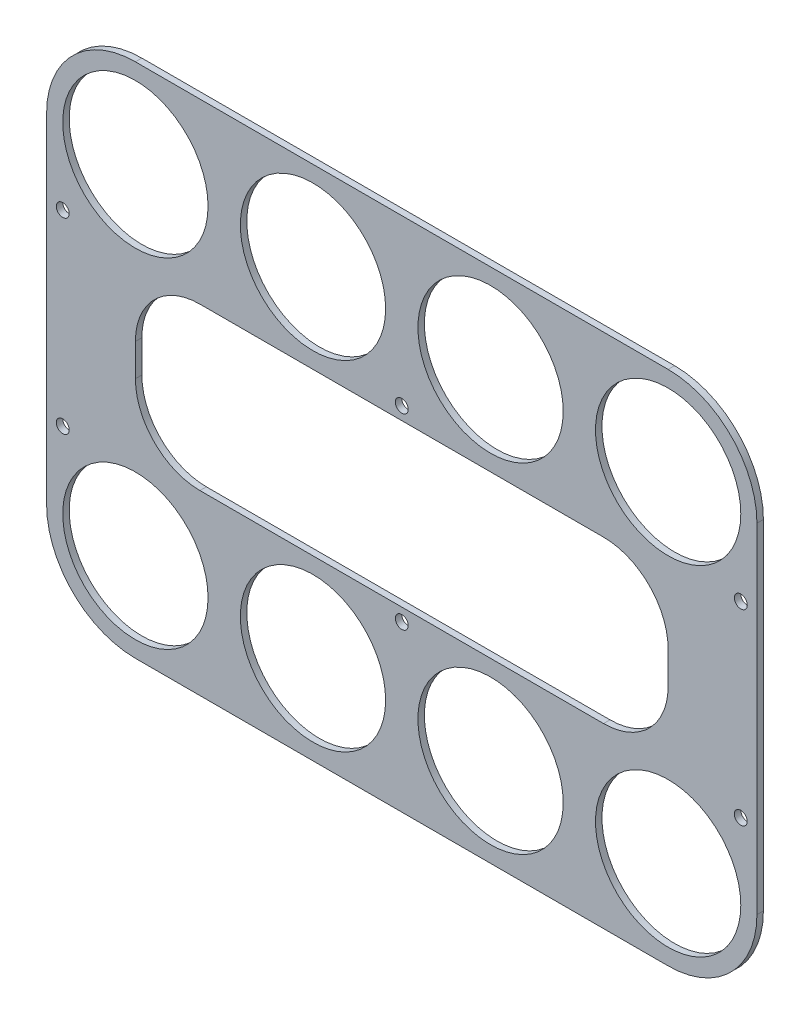
ISO-10303-21;
HEADER;
FILE_DESCRIPTION(('STEP AP214'),'2;1');
FILE_NAME('part.step','',(''),(''),'','','');
FILE_SCHEMA(('AUTOMOTIVE_DESIGN { 1 0 10303 214 1 1 1 1 }'));
ENDSEC;
DATA;
#1=APPLICATION_CONTEXT('core data for automotive mechanical design processes');
#2=APPLICATION_PROTOCOL_DEFINITION('international standard','automotive_design',2000,#1);
#3=PRODUCT_CONTEXT('',#1,'mechanical');
#4=PRODUCT('Part','Part','',(#3));
#5=PRODUCT_RELATED_PRODUCT_CATEGORY('part','',(#4));
#6=PRODUCT_DEFINITION_FORMATION('','',#4);
#7=PRODUCT_DEFINITION_CONTEXT('part definition',#1,'design');
#8=PRODUCT_DEFINITION('design','',#6,#7);
#9=PRODUCT_DEFINITION_SHAPE('','',#8);
#10=(LENGTH_UNIT() NAMED_UNIT(*) SI_UNIT(.MILLI.,.METRE.));
#11=(NAMED_UNIT(*) PLANE_ANGLE_UNIT() SI_UNIT($,.RADIAN.));
#12=(NAMED_UNIT(*) SI_UNIT($,.STERADIAN.) SOLID_ANGLE_UNIT());
#13=UNCERTAINTY_MEASURE_WITH_UNIT(LENGTH_MEASURE(1.E-05),#10,'distance_accuracy_value','');
#14=(GEOMETRIC_REPRESENTATION_CONTEXT(3) GLOBAL_UNCERTAINTY_ASSIGNED_CONTEXT((#13)) GLOBAL_UNIT_ASSIGNED_CONTEXT((#10,
#11,#12)) REPRESENTATION_CONTEXT('',''));
#15=CARTESIAN_POINT('',(0.,0.,0.));
#16=DIRECTION('',(0.,0.,1.));
#17=DIRECTION('',(1.,0.,0.));
#18=AXIS2_PLACEMENT_3D('',#15,#16,#17);
#19=CARTESIAN_POINT('',(74.5679017625473,-66.9135800687628,0.));
#20=DIRECTION('',(0.,0.,1.));
#21=DIRECTION('',(1.,0.,0.));
#22=AXIS2_PLACEMENT_3D('',#19,#20,#21);
#23=PLANE('',#22);
#24=CARTESIAN_POINT('',(12.0679017625473,-71.9135800687628,0.));
#25=DIRECTION('',(0.,0.,-1.));
#26=DIRECTION('',(-1.,0.,0.));
#27=AXIS2_PLACEMENT_3D('',#24,#25,#26);
#28=CIRCLE('',#27,20.);
#29=CARTESIAN_POINT('',(-7.93209823745267,-71.9135800687628,0.));
#30=VERTEX_POINT('',#29);
#31=CARTESIAN_POINT('',(12.0679017625473,-91.9135800687628,0.));
#32=VERTEX_POINT('',#31);
#33=EDGE_CURVE('E267',#30,#32,#28,.F.);
#34=ORIENTED_EDGE('',*,*,#33,.T.);
#35=DIRECTION('',(1.,0.,0.));
#36=VECTOR('',#35,1.);
#37=CARTESIAN_POINT('',(-7.93209823745267,-91.9135800687628,0.));
#38=LINE('',#37,#36);
#39=CARTESIAN_POINT('',(137.067901762547,-91.9135800687628,0.));
#40=VERTEX_POINT('',#39);
#41=EDGE_CURVE('E361',#32,#40,#38,.T.);
#42=ORIENTED_EDGE('',*,*,#41,.T.);
#43=CARTESIAN_POINT('',(137.067901762547,-71.9135800687628,0.));
#44=DIRECTION('',(0.,0.,-1.));
#45=DIRECTION('',(-1.,0.,0.));
#46=AXIS2_PLACEMENT_3D('',#43,#44,#45);
#47=CIRCLE('',#46,20.);
#48=CARTESIAN_POINT('',(157.067901762547,-71.9135800687628,0.));
#49=VERTEX_POINT('',#48);
#50=EDGE_CURVE('E270',#40,#49,#47,.F.);
#51=ORIENTED_EDGE('',*,*,#50,.T.);
#52=DIRECTION('',(0.,1.,0.));
#53=VECTOR('',#52,1.);
#54=CARTESIAN_POINT('',(157.067901762547,-91.9135800687628,0.));
#55=LINE('',#54,#53);
#56=CARTESIAN_POINT('',(157.067901762547,-61.9135800687628,0.));
#57=VERTEX_POINT('',#56);
#58=EDGE_CURVE('E364',#49,#57,#55,.T.);
#59=ORIENTED_EDGE('',*,*,#58,.T.);
#60=CARTESIAN_POINT('',(137.067901762547,-61.9135800687628,0.));
#61=DIRECTION('',(0.,0.,-1.));
#62=DIRECTION('',(-1.,0.,0.));
#63=AXIS2_PLACEMENT_3D('',#60,#61,#62);
#64=CIRCLE('',#63,20.);
#65=CARTESIAN_POINT('',(137.067901762547,-41.9135800687628,0.));
#66=VERTEX_POINT('',#65);
#67=EDGE_CURVE('E274',#57,#66,#64,.F.);
#68=ORIENTED_EDGE('',*,*,#67,.T.);
#69=DIRECTION('',(1.,0.,0.));
#70=VECTOR('',#69,1.);
#71=CARTESIAN_POINT('',(157.067901762547,-41.9135800687628,0.));
#72=LINE('',#71,#70);
#73=CARTESIAN_POINT('',(12.0679017625473,-41.9135800687628,0.));
#74=VERTEX_POINT('',#73);
#75=EDGE_CURVE('E159',#66,#74,#72,.F.);
#76=ORIENTED_EDGE('',*,*,#75,.T.);
#77=CARTESIAN_POINT('',(12.0679017625473,-61.9135800687628,0.));
#78=DIRECTION('',(0.,0.,-1.));
#79=DIRECTION('',(-1.,0.,0.));
#80=AXIS2_PLACEMENT_3D('',#77,#78,#79);
#81=CIRCLE('',#80,20.);
#82=CARTESIAN_POINT('',(-7.93209823745267,-61.9135800687628,0.));
#83=VERTEX_POINT('',#82);
#84=EDGE_CURVE('E278',#74,#83,#81,.F.);
#85=ORIENTED_EDGE('',*,*,#84,.T.);
#86=DIRECTION('',(0.,1.,0.));
#87=VECTOR('',#86,1.);
#88=CARTESIAN_POINT('',(-7.93209823745267,-41.9135800687628,0.));
#89=LINE('',#88,#87);
#90=EDGE_CURVE('E281',#83,#30,#89,.F.);
#91=ORIENTED_EDGE('',*,*,#90,.T.);
#92=EDGE_LOOP('',(#34,#42,#51,#59,#68,#76,#85,#91));
#93=FACE_BOUND('',#92,.T.);
#94=CARTESIAN_POINT('',(-7.93209823745267,-14.4135800687628,0.));
#95=DIRECTION('',(0.,0.,1.));
#96=DIRECTION('',(1.,0.,0.));
#97=AXIS2_PLACEMENT_3D('',#94,#95,#96);
#98=CIRCLE('',#97,22.5);
#99=CARTESIAN_POINT('',(14.5679017625473,-14.4135800687628,0.));
#100=VERTEX_POINT('',#99);
#101=EDGE_CURVE('E282',#100,#100,#98,.T.);
#102=ORIENTED_EDGE('',*,*,#101,.T.);
#103=EDGE_LOOP('',(#102));
#104=FACE_BOUND('',#103,.T.);
#105=CARTESIAN_POINT('',(157.067901762547,-14.4135800687628,0.));
#106=DIRECTION('',(0.,0.,1.));
#107=DIRECTION('',(1.,0.,0.));
#108=AXIS2_PLACEMENT_3D('',#105,#106,#107);
#109=CIRCLE('',#108,22.5);
#110=CARTESIAN_POINT('',(179.567901762547,-14.4135800687628,0.));
#111=VERTEX_POINT('',#110);
#112=EDGE_CURVE('E285',#111,#111,#109,.T.);
#113=ORIENTED_EDGE('',*,*,#112,.T.);
#114=EDGE_LOOP('',(#113));
#115=FACE_BOUND('',#114,.T.);
#116=CARTESIAN_POINT('',(157.067901762547,-119.413580068763,0.));
#117=DIRECTION('',(0.,0.,1.));
#118=DIRECTION('',(1.,0.,0.));
#119=AXIS2_PLACEMENT_3D('',#116,#117,#118);
#120=CIRCLE('',#119,22.5);
#121=CARTESIAN_POINT('',(179.567901762547,-119.413580068763,0.));
#122=VERTEX_POINT('',#121);
#123=EDGE_CURVE('E290',#122,#122,#120,.T.);
#124=ORIENTED_EDGE('',*,*,#123,.T.);
#125=EDGE_LOOP('',(#124));
#126=FACE_BOUND('',#125,.T.);
#127=CARTESIAN_POINT('',(-7.93209823745267,-119.413580068763,0.));
#128=DIRECTION('',(0.,0.,1.));
#129=DIRECTION('',(1.,0.,0.));
#130=AXIS2_PLACEMENT_3D('',#127,#128,#129);
#131=CIRCLE('',#130,22.5);
#132=CARTESIAN_POINT('',(14.5679017625473,-119.413580068763,0.));
#133=VERTEX_POINT('',#132);
#134=EDGE_CURVE('E295',#133,#133,#131,.T.);
#135=ORIENTED_EDGE('',*,*,#134,.T.);
#136=EDGE_LOOP('',(#135));
#137=FACE_BOUND('',#136,.T.);
#138=CARTESIAN_POINT('',(47.0679017625473,-14.4135800687628,0.));
#139=DIRECTION('',(0.,0.,1.));
#140=DIRECTION('',(1.,0.,0.));
#141=AXIS2_PLACEMENT_3D('',#138,#139,#140);
#142=CIRCLE('',#141,22.5);
#143=CARTESIAN_POINT('',(69.5679017625473,-14.4135800687628,0.));
#144=VERTEX_POINT('',#143);
#145=EDGE_CURVE('E300',#144,#144,#142,.T.);
#146=ORIENTED_EDGE('',*,*,#145,.T.);
#147=EDGE_LOOP('',(#146));
#148=FACE_BOUND('',#147,.T.);
#149=CARTESIAN_POINT('',(102.067901762547,-14.4135800687628,0.));
#150=DIRECTION('',(0.,0.,1.));
#151=DIRECTION('',(1.,0.,0.));
#152=AXIS2_PLACEMENT_3D('',#149,#150,#151);
#153=CIRCLE('',#152,22.5);
#154=CARTESIAN_POINT('',(124.567901762547,-14.4135800687628,0.));
#155=VERTEX_POINT('',#154);
#156=EDGE_CURVE('E305',#155,#155,#153,.T.);
#157=ORIENTED_EDGE('',*,*,#156,.T.);
#158=EDGE_LOOP('',(#157));
#159=FACE_BOUND('',#158,.T.);
#160=CARTESIAN_POINT('',(102.067901762547,-119.413580068763,0.));
#161=DIRECTION('',(0.,0.,1.));
#162=DIRECTION('',(1.,0.,0.));
#163=AXIS2_PLACEMENT_3D('',#160,#161,#162);
#164=CIRCLE('',#163,22.5);
#165=CARTESIAN_POINT('',(124.567901762547,-119.413580068763,0.));
#166=VERTEX_POINT('',#165);
#167=EDGE_CURVE('E310',#166,#166,#164,.T.);
#168=ORIENTED_EDGE('',*,*,#167,.T.);
#169=EDGE_LOOP('',(#168));
#170=FACE_BOUND('',#169,.T.);
#171=CARTESIAN_POINT('',(47.0679017625473,-119.413580068763,0.));
#172=DIRECTION('',(0.,0.,1.));
#173=DIRECTION('',(1.,0.,0.));
#174=AXIS2_PLACEMENT_3D('',#171,#172,#173);
#175=CIRCLE('',#174,22.5);
#176=CARTESIAN_POINT('',(69.5679017625473,-119.413580068763,0.));
#177=VERTEX_POINT('',#176);
#178=EDGE_CURVE('E315',#177,#177,#175,.T.);
#179=ORIENTED_EDGE('',*,*,#178,.T.);
#180=EDGE_LOOP('',(#179));
#181=FACE_BOUND('',#180,.T.);
#182=CARTESIAN_POINT('',(-30.4320982374527,-37.9135800687628,0.));
#183=DIRECTION('',(0.,0.,1.));
#184=DIRECTION('',(1.,0.,0.));
#185=AXIS2_PLACEMENT_3D('',#182,#183,#184);
#186=CIRCLE('',#185,2.);
#187=CARTESIAN_POINT('',(-28.4320982374527,-37.9135800687628,0.));
#188=VERTEX_POINT('',#187);
#189=EDGE_CURVE('E320',#188,#188,#186,.T.);
#190=ORIENTED_EDGE('',*,*,#189,.T.);
#191=EDGE_LOOP('',(#190));
#192=FACE_BOUND('',#191,.T.);
#193=CARTESIAN_POINT('',(74.5679017625473,-37.9135800687628,0.));
#194=DIRECTION('',(0.,0.,1.));
#195=DIRECTION('',(1.,0.,0.));
#196=AXIS2_PLACEMENT_3D('',#193,#194,#195);
#197=CIRCLE('',#196,2.);
#198=CARTESIAN_POINT('',(76.5679017625473,-37.9135800687628,0.));
#199=VERTEX_POINT('',#198);
#200=EDGE_CURVE('E325',#199,#199,#197,.T.);
#201=ORIENTED_EDGE('',*,*,#200,.T.);
#202=EDGE_LOOP('',(#201));
#203=FACE_BOUND('',#202,.T.);
#204=CARTESIAN_POINT('',(179.567901762547,-37.9135800687628,0.));
#205=DIRECTION('',(0.,0.,1.));
#206=DIRECTION('',(1.,0.,0.));
#207=AXIS2_PLACEMENT_3D('',#204,#205,#206);
#208=CIRCLE('',#207,2.);
#209=CARTESIAN_POINT('',(181.567901762547,-37.9135800687628,0.));
#210=VERTEX_POINT('',#209);
#211=EDGE_CURVE('E330',#210,#210,#208,.T.);
#212=ORIENTED_EDGE('',*,*,#211,.T.);
#213=EDGE_LOOP('',(#212));
#214=FACE_BOUND('',#213,.T.);
#215=CARTESIAN_POINT('',(179.567901762547,-95.9135800687628,0.));
#216=DIRECTION('',(0.,0.,1.));
#217=DIRECTION('',(1.,0.,0.));
#218=AXIS2_PLACEMENT_3D('',#215,#216,#217);
#219=CIRCLE('',#218,2.);
#220=CARTESIAN_POINT('',(181.567901762547,-95.9135800687628,0.));
#221=VERTEX_POINT('',#220);
#222=EDGE_CURVE('E335',#221,#221,#219,.T.);
#223=ORIENTED_EDGE('',*,*,#222,.T.);
#224=EDGE_LOOP('',(#223));
#225=FACE_BOUND('',#224,.T.);
#226=CARTESIAN_POINT('',(74.5679017625473,-95.9135800687628,0.));
#227=DIRECTION('',(0.,0.,1.));
#228=DIRECTION('',(1.,0.,0.));
#229=AXIS2_PLACEMENT_3D('',#226,#227,#228);
#230=CIRCLE('',#229,2.);
#231=CARTESIAN_POINT('',(76.5679017625473,-95.9135800687628,0.));
#232=VERTEX_POINT('',#231);
#233=EDGE_CURVE('E154',#232,#232,#230,.T.);
#234=ORIENTED_EDGE('',*,*,#233,.T.);
#235=EDGE_LOOP('',(#234));
#236=FACE_BOUND('',#235,.T.);
#237=CARTESIAN_POINT('',(-30.4320982374527,-95.9135800687628,0.));
#238=DIRECTION('',(0.,0.,1.));
#239=DIRECTION('',(1.,0.,0.));
#240=AXIS2_PLACEMENT_3D('',#237,#238,#239);
#241=CIRCLE('',#240,2.);
#242=CARTESIAN_POINT('',(-28.4320982374527,-95.9135800687628,0.));
#243=VERTEX_POINT('',#242);
#244=EDGE_CURVE('E151',#243,#243,#241,.T.);
#245=ORIENTED_EDGE('',*,*,#244,.T.);
#246=EDGE_LOOP('',(#245));
#247=FACE_BOUND('',#246,.T.);
#248=DIRECTION('',(0.,1.,0.));
#249=VECTOR('',#248,1.);
#250=CARTESIAN_POINT('',(-35.4320982374527,-146.913580068763,0.));
#251=LINE('',#250,#249);
#252=CARTESIAN_POINT('',(-35.4320982374527,-14.4135800687628,0.));
#253=VERTEX_POINT('',#252);
#254=CARTESIAN_POINT('',(-35.4320982374527,-119.413580068763,0.));
#255=VERTEX_POINT('',#254);
#256=EDGE_CURVE('E132',#253,#255,#251,.F.);
#257=ORIENTED_EDGE('',*,*,#256,.F.);
#258=CARTESIAN_POINT('',(-7.93209823745268,-14.4135800687628,0.));
#259=DIRECTION('',(0.,0.,1.));
#260=DIRECTION('',(1.,0.,0.));
#261=AXIS2_PLACEMENT_3D('',#258,#259,#260);
#262=CIRCLE('',#261,27.5);
#263=CARTESIAN_POINT('',(-7.93209823745268,13.0864199312372,0.));
#264=VERTEX_POINT('',#263);
#265=EDGE_CURVE('E148',#264,#253,#262,.T.);
#266=ORIENTED_EDGE('',*,*,#265,.F.);
#267=DIRECTION('',(1.,0.,0.));
#268=VECTOR('',#267,1.);
#269=CARTESIAN_POINT('',(-35.4320982374527,13.0864199312372,0.));
#270=LINE('',#269,#268);
#271=CARTESIAN_POINT('',(157.067901762547,13.0864199312372,0.));
#272=VERTEX_POINT('',#271);
#273=EDGE_CURVE('E161',#272,#264,#270,.F.);
#274=ORIENTED_EDGE('',*,*,#273,.F.);
#275=CARTESIAN_POINT('',(157.067901762547,-14.4135800687628,0.));
#276=DIRECTION('',(0.,0.,1.));
#277=DIRECTION('',(1.,0.,0.));
#278=AXIS2_PLACEMENT_3D('',#275,#276,#277);
#279=CIRCLE('',#278,27.5);
#280=CARTESIAN_POINT('',(184.567901762547,-14.4135800687628,0.));
#281=VERTEX_POINT('',#280);
#282=EDGE_CURVE('E349',#281,#272,#279,.T.);
#283=ORIENTED_EDGE('',*,*,#282,.F.);
#284=DIRECTION('',(0.,1.,0.));
#285=VECTOR('',#284,1.);
#286=CARTESIAN_POINT('',(184.567901762547,13.0864199312372,0.));
#287=LINE('',#286,#285);
#288=CARTESIAN_POINT('',(184.567901762547,-119.413580068763,0.));
#289=VERTEX_POINT('',#288);
#290=EDGE_CURVE('E165',#289,#281,#287,.T.);
#291=ORIENTED_EDGE('',*,*,#290,.F.);
#292=CARTESIAN_POINT('',(157.067901762547,-119.413580068763,0.));
#293=DIRECTION('',(0.,0.,1.));
#294=DIRECTION('',(1.,0.,0.));
#295=AXIS2_PLACEMENT_3D('',#292,#293,#294);
#296=CIRCLE('',#295,27.5);
#297=CARTESIAN_POINT('',(157.067901762547,-146.913580068763,0.));
#298=VERTEX_POINT('',#297);
#299=EDGE_CURVE('E350',#298,#289,#296,.T.);
#300=ORIENTED_EDGE('',*,*,#299,.F.);
#301=DIRECTION('',(1.,0.,0.));
#302=VECTOR('',#301,1.);
#303=CARTESIAN_POINT('',(184.567901762547,-146.913580068763,0.));
#304=LINE('',#303,#302);
#305=CARTESIAN_POINT('',(-7.93209823745265,-146.913580068763,0.));
#306=VERTEX_POINT('',#305);
#307=EDGE_CURVE('E135',#306,#298,#304,.T.);
#308=ORIENTED_EDGE('',*,*,#307,.F.);
#309=CARTESIAN_POINT('',(-7.93209823745265,-119.413580068763,0.));
#310=DIRECTION('',(0.,0.,1.));
#311=DIRECTION('',(1.,0.,0.));
#312=AXIS2_PLACEMENT_3D('',#309,#310,#311);
#313=CIRCLE('',#312,27.5);
#314=EDGE_CURVE('E20',#255,#306,#313,.T.);
#315=ORIENTED_EDGE('',*,*,#314,.F.);
#316=EDGE_LOOP('',(#257,#266,#274,#283,#291,#300,#308,#315));
#317=FACE_BOUND('',#316,.T.);
#318=ADVANCED_FACE('F17',(#93,#104,#115,#126,#137,#148,#159,#170,#181,#192,#203,#214,#225,#236,
#247,#317),#23,.F.);
#319=CARTESIAN_POINT('',(-7.93209823745265,-119.413580068763,0.));
#320=DIRECTION('',(0.,0.,1.));
#321=DIRECTION('',(1.,0.,0.));
#322=AXIS2_PLACEMENT_3D('',#319,#320,#321);
#323=CYLINDRICAL_SURFACE('',#322,27.5);
#324=ORIENTED_EDGE('',*,*,#314,.T.);
#325=DIRECTION('',(0.,0.,-1.));
#326=VECTOR('',#325,1.);
#327=CARTESIAN_POINT('',(-7.93209823745264,-146.913580068763,0.));
#328=LINE('',#327,#326);
#329=CARTESIAN_POINT('',(-7.93209823745265,-146.913580068763,2.));
#330=VERTEX_POINT('',#329);
#331=EDGE_CURVE('E138',#330,#306,#328,.T.);
#332=ORIENTED_EDGE('',*,*,#331,.F.);
#333=CARTESIAN_POINT('',(-7.93209823745265,-119.413580068763,2.));
#334=DIRECTION('',(0.,0.,1.));
#335=DIRECTION('',(1.,0.,0.));
#336=AXIS2_PLACEMENT_3D('',#333,#334,#335);
#337=CIRCLE('',#336,27.5);
#338=CARTESIAN_POINT('',(-35.4320982374527,-119.413580068763,2.));
#339=VERTEX_POINT('',#338);
#340=EDGE_CURVE('E143',#339,#330,#337,.T.);
#341=ORIENTED_EDGE('',*,*,#340,.F.);
#342=DIRECTION('',(0.,0.,1.));
#343=VECTOR('',#342,1.);
#344=CARTESIAN_POINT('',(-35.4320982374527,-119.413580068763,0.));
#345=LINE('',#344,#343);
#346=EDGE_CURVE('E140',#255,#339,#345,.T.);
#347=ORIENTED_EDGE('',*,*,#346,.F.);
#348=EDGE_LOOP('',(#324,#332,#341,#347));
#349=FACE_BOUND('',#348,.T.);
#350=ADVANCED_FACE('F141',(#349),#323,.T.);
#351=CARTESIAN_POINT('',(184.567901762547,-146.913580068763,0.));
#352=DIRECTION('',(0.,-1.,0.));
#353=DIRECTION('',(0.,0.,-1.));
#354=AXIS2_PLACEMENT_3D('',#351,#352,#353);
#355=PLANE('',#354);
#356=DIRECTION('',(0.,0.,1.));
#357=VECTOR('',#356,1.);
#358=CARTESIAN_POINT('',(157.067901762547,-146.913580068763,0.));
#359=LINE('',#358,#357);
#360=CARTESIAN_POINT('',(157.067901762547,-146.913580068763,2.));
#361=VERTEX_POINT('',#360);
#362=EDGE_CURVE('E169',#361,#298,#359,.F.);
#363=ORIENTED_EDGE('',*,*,#362,.F.);
#364=DIRECTION('',(1.,0.,0.));
#365=VECTOR('',#364,1.);
#366=CARTESIAN_POINT('',(74.5679017625473,-146.913580068763,2.));
#367=LINE('',#366,#365);
#368=EDGE_CURVE('E265',#330,#361,#367,.T.);
#369=ORIENTED_EDGE('',*,*,#368,.F.);
#370=ORIENTED_EDGE('',*,*,#331,.T.);
#371=ORIENTED_EDGE('',*,*,#307,.T.);
#372=EDGE_LOOP('',(#363,#369,#370,#371));
#373=FACE_BOUND('',#372,.T.);
#374=ADVANCED_FACE('F535',(#373),#355,.T.);
#375=CARTESIAN_POINT('',(157.067901762547,-119.413580068763,0.));
#376=DIRECTION('',(0.,0.,1.));
#377=DIRECTION('',(1.,0.,0.));
#378=AXIS2_PLACEMENT_3D('',#375,#376,#377);
#379=CYLINDRICAL_SURFACE('',#378,27.5);
#380=ORIENTED_EDGE('',*,*,#299,.T.);
#381=DIRECTION('',(0.,0.,-1.));
#382=VECTOR('',#381,1.);
#383=CARTESIAN_POINT('',(184.567901762547,-119.413580068763,0.));
#384=LINE('',#383,#382);
#385=CARTESIAN_POINT('',(184.567901762547,-119.413580068763,2.));
#386=VERTEX_POINT('',#385);
#387=EDGE_CURVE('E168',#386,#289,#384,.T.);
#388=ORIENTED_EDGE('',*,*,#387,.F.);
#389=CARTESIAN_POINT('',(157.067901762547,-119.413580068763,2.));
#390=DIRECTION('',(0.,0.,1.));
#391=DIRECTION('',(1.,0.,0.));
#392=AXIS2_PLACEMENT_3D('',#389,#390,#391);
#393=CIRCLE('',#392,27.5);
#394=EDGE_CURVE('E262',#361,#386,#393,.T.);
#395=ORIENTED_EDGE('',*,*,#394,.F.);
#396=ORIENTED_EDGE('',*,*,#362,.T.);
#397=EDGE_LOOP('',(#380,#388,#395,#396));
#398=FACE_BOUND('',#397,.T.);
#399=ADVANCED_FACE('F585',(#398),#379,.T.);
#400=CARTESIAN_POINT('',(184.567901762547,13.0864199312372,0.));
#401=DIRECTION('',(1.,0.,0.));
#402=DIRECTION('',(0.,0.,-1.));
#403=AXIS2_PLACEMENT_3D('',#400,#401,#402);
#404=PLANE('',#403);
#405=DIRECTION('',(0.,0.,1.));
#406=VECTOR('',#405,1.);
#407=CARTESIAN_POINT('',(184.567901762547,-14.4135800687628,0.));
#408=LINE('',#407,#406);
#409=CARTESIAN_POINT('',(184.567901762547,-14.4135800687628,2.));
#410=VERTEX_POINT('',#409);
#411=EDGE_CURVE('E167',#410,#281,#408,.F.);
#412=ORIENTED_EDGE('',*,*,#411,.F.);
#413=DIRECTION('',(0.,1.,0.));
#414=VECTOR('',#413,1.);
#415=CARTESIAN_POINT('',(184.567901762547,-66.9135800687628,2.));
#416=LINE('',#415,#414);
#417=EDGE_CURVE('E261',#386,#410,#416,.T.);
#418=ORIENTED_EDGE('',*,*,#417,.F.);
#419=ORIENTED_EDGE('',*,*,#387,.T.);
#420=ORIENTED_EDGE('',*,*,#290,.T.);
#421=EDGE_LOOP('',(#412,#418,#419,#420));
#422=FACE_BOUND('',#421,.T.);
#423=ADVANCED_FACE('F391',(#422),#404,.T.);
#424=CARTESIAN_POINT('',(157.067901762547,-14.4135800687628,0.));
#425=DIRECTION('',(0.,0.,1.));
#426=DIRECTION('',(1.,0.,0.));
#427=AXIS2_PLACEMENT_3D('',#424,#425,#426);
#428=CYLINDRICAL_SURFACE('',#427,27.5);
#429=ORIENTED_EDGE('',*,*,#282,.T.);
#430=DIRECTION('',(0.,0.,1.));
#431=VECTOR('',#430,1.);
#432=CARTESIAN_POINT('',(157.067901762547,13.0864199312372,0.));
#433=LINE('',#432,#431);
#434=CARTESIAN_POINT('',(157.067901762547,13.0864199312372,2.));
#435=VERTEX_POINT('',#434);
#436=EDGE_CURVE('E164',#435,#272,#433,.F.);
#437=ORIENTED_EDGE('',*,*,#436,.F.);
#438=CARTESIAN_POINT('',(157.067901762547,-14.4135800687628,2.));
#439=DIRECTION('',(0.,0.,1.));
#440=DIRECTION('',(1.,0.,0.));
#441=AXIS2_PLACEMENT_3D('',#438,#439,#440);
#442=CIRCLE('',#441,27.5);
#443=EDGE_CURVE('E258',#410,#435,#442,.T.);
#444=ORIENTED_EDGE('',*,*,#443,.F.);
#445=ORIENTED_EDGE('',*,*,#411,.T.);
#446=EDGE_LOOP('',(#429,#437,#444,#445));
#447=FACE_BOUND('',#446,.T.);
#448=ADVANCED_FACE('F385',(#447),#428,.T.);
#449=CARTESIAN_POINT('',(-35.4320982374527,13.0864199312372,0.));
#450=DIRECTION('',(0.,1.,0.));
#451=DIRECTION('',(0.,0.,1.));
#452=AXIS2_PLACEMENT_3D('',#449,#450,#451);
#453=PLANE('',#452);
#454=DIRECTION('',(0.,0.,1.));
#455=VECTOR('',#454,1.);
#456=CARTESIAN_POINT('',(-7.93209823745268,13.0864199312372,0.));
#457=LINE('',#456,#455);
#458=CARTESIAN_POINT('',(-7.93209823745268,13.0864199312372,2.));
#459=VERTEX_POINT('',#458);
#460=EDGE_CURVE('E163',#459,#264,#457,.F.);
#461=ORIENTED_EDGE('',*,*,#460,.F.);
#462=DIRECTION('',(1.,0.,0.));
#463=VECTOR('',#462,1.);
#464=CARTESIAN_POINT('',(74.5679017625473,13.0864199312372,2.));
#465=LINE('',#464,#463);
#466=EDGE_CURVE('E257',#435,#459,#465,.F.);
#467=ORIENTED_EDGE('',*,*,#466,.F.);
#468=ORIENTED_EDGE('',*,*,#436,.T.);
#469=ORIENTED_EDGE('',*,*,#273,.T.);
#470=EDGE_LOOP('',(#461,#467,#468,#469));
#471=FACE_BOUND('',#470,.T.);
#472=ADVANCED_FACE('F394',(#471),#453,.T.);
#473=CARTESIAN_POINT('',(-7.93209823745268,-14.4135800687628,0.));
#474=DIRECTION('',(0.,0.,1.));
#475=DIRECTION('',(1.,0.,0.));
#476=AXIS2_PLACEMENT_3D('',#473,#474,#475);
#477=CYLINDRICAL_SURFACE('',#476,27.5);
#478=ORIENTED_EDGE('',*,*,#265,.T.);
#479=DIRECTION('',(0.,0.,1.));
#480=VECTOR('',#479,1.);
#481=CARTESIAN_POINT('',(-35.4320982374527,-14.4135800687628,0.));
#482=LINE('',#481,#480);
#483=CARTESIAN_POINT('',(-35.4320982374527,-14.4135800687628,2.));
#484=VERTEX_POINT('',#483);
#485=EDGE_CURVE('E147',#484,#253,#482,.F.);
#486=ORIENTED_EDGE('',*,*,#485,.F.);
#487=CARTESIAN_POINT('',(-7.93209823745268,-14.4135800687628,2.));
#488=DIRECTION('',(0.,0.,1.));
#489=DIRECTION('',(1.,0.,0.));
#490=AXIS2_PLACEMENT_3D('',#487,#488,#489);
#491=CIRCLE('',#490,27.5);
#492=EDGE_CURVE('E254',#459,#484,#491,.T.);
#493=ORIENTED_EDGE('',*,*,#492,.F.);
#494=ORIENTED_EDGE('',*,*,#460,.T.);
#495=EDGE_LOOP('',(#478,#486,#493,#494));
#496=FACE_BOUND('',#495,.T.);
#497=ADVANCED_FACE('F429',(#496),#477,.T.);
#498=CARTESIAN_POINT('',(-35.4320982374527,-146.913580068763,0.));
#499=DIRECTION('',(-1.,0.,0.));
#500=DIRECTION('',(0.,0.,1.));
#501=AXIS2_PLACEMENT_3D('',#498,#499,#500);
#502=PLANE('',#501);
#503=ORIENTED_EDGE('',*,*,#485,.T.);
#504=ORIENTED_EDGE('',*,*,#256,.T.);
#505=ORIENTED_EDGE('',*,*,#346,.T.);
#506=DIRECTION('',(0.,1.,0.));
#507=VECTOR('',#506,1.);
#508=CARTESIAN_POINT('',(-35.4320982374527,-66.9135800687628,2.));
#509=LINE('',#508,#507);
#510=EDGE_CURVE('E251',#484,#339,#509,.F.);
#511=ORIENTED_EDGE('',*,*,#510,.F.);
#512=EDGE_LOOP('',(#503,#504,#505,#511));
#513=FACE_BOUND('',#512,.T.);
#514=ADVANCED_FACE('F150',(#513),#502,.T.);
#515=CARTESIAN_POINT('',(-30.4320982374527,-95.9135800687628,-270.036762221579));
#516=DIRECTION('',(0.,0.,1.));
#517=DIRECTION('',(1.,0.,0.));
#518=AXIS2_PLACEMENT_3D('',#515,#516,#517);
#519=CYLINDRICAL_SURFACE('',#518,2.);
#520=CARTESIAN_POINT('',(-30.4320982374527,-95.9135800687628,2.));
#521=DIRECTION('',(0.,0.,1.));
#522=DIRECTION('',(1.,0.,0.));
#523=AXIS2_PLACEMENT_3D('',#520,#521,#522);
#524=CIRCLE('',#523,2.);
#525=CARTESIAN_POINT('',(-28.4320982374527,-95.9135800687628,2.));
#526=VERTEX_POINT('',#525);
#527=EDGE_CURVE('E246',#526,#526,#524,.F.);
#528=ORIENTED_EDGE('',*,*,#527,.F.);
#529=EDGE_LOOP('',(#528));
#530=FACE_BOUND('',#529,.T.);
#531=ORIENTED_EDGE('',*,*,#244,.F.);
#532=EDGE_LOOP('',(#531));
#533=FACE_BOUND('',#532,.T.);
#534=ADVANCED_FACE('F437',(#530,#533),#519,.F.);
#535=CARTESIAN_POINT('',(74.5679017625473,-95.9135800687628,-270.036762221579));
#536=DIRECTION('',(0.,0.,1.));
#537=DIRECTION('',(1.,0.,0.));
#538=AXIS2_PLACEMENT_3D('',#535,#536,#537);
#539=CYLINDRICAL_SURFACE('',#538,2.);
#540=CARTESIAN_POINT('',(74.5679017625473,-95.9135800687628,2.));
#541=DIRECTION('',(0.,0.,1.));
#542=DIRECTION('',(1.,0.,0.));
#543=AXIS2_PLACEMENT_3D('',#540,#541,#542);
#544=CIRCLE('',#543,2.);
#545=CARTESIAN_POINT('',(76.5679017625473,-95.9135800687628,2.));
#546=VERTEX_POINT('',#545);
#547=EDGE_CURVE('E241',#546,#546,#544,.F.);
#548=ORIENTED_EDGE('',*,*,#547,.F.);
#549=EDGE_LOOP('',(#548));
#550=FACE_BOUND('',#549,.T.);
#551=ORIENTED_EDGE('',*,*,#233,.F.);
#552=EDGE_LOOP('',(#551));
#553=FACE_BOUND('',#552,.T.);
#554=ADVANCED_FACE('F518',(#550,#553),#539,.F.);
#555=CARTESIAN_POINT('',(179.567901762547,-95.9135800687628,-270.036762221579));
#556=DIRECTION('',(0.,0.,1.));
#557=DIRECTION('',(1.,0.,0.));
#558=AXIS2_PLACEMENT_3D('',#555,#556,#557);
#559=CYLINDRICAL_SURFACE('',#558,2.);
#560=CARTESIAN_POINT('',(179.567901762547,-95.9135800687628,2.));
#561=DIRECTION('',(0.,0.,1.));
#562=DIRECTION('',(1.,0.,0.));
#563=AXIS2_PLACEMENT_3D('',#560,#561,#562);
#564=CIRCLE('',#563,2.);
#565=CARTESIAN_POINT('',(181.567901762547,-95.9135800687628,2.));
#566=VERTEX_POINT('',#565);
#567=EDGE_CURVE('E236',#566,#566,#564,.F.);
#568=ORIENTED_EDGE('',*,*,#567,.F.);
#569=EDGE_LOOP('',(#568));
#570=FACE_BOUND('',#569,.T.);
#571=ORIENTED_EDGE('',*,*,#222,.F.);
#572=EDGE_LOOP('',(#571));
#573=FACE_BOUND('',#572,.T.);
#574=ADVANCED_FACE('F514',(#570,#573),#559,.F.);
#575=CARTESIAN_POINT('',(179.567901762547,-37.9135800687628,-270.036762221579));
#576=DIRECTION('',(0.,0.,1.));
#577=DIRECTION('',(1.,0.,0.));
#578=AXIS2_PLACEMENT_3D('',#575,#576,#577);
#579=CYLINDRICAL_SURFACE('',#578,2.);
#580=CARTESIAN_POINT('',(179.567901762547,-37.9135800687628,2.));
#581=DIRECTION('',(0.,0.,1.));
#582=DIRECTION('',(1.,0.,0.));
#583=AXIS2_PLACEMENT_3D('',#580,#581,#582);
#584=CIRCLE('',#583,2.);
#585=CARTESIAN_POINT('',(181.567901762547,-37.9135800687628,2.));
#586=VERTEX_POINT('',#585);
#587=EDGE_CURVE('E231',#586,#586,#584,.F.);
#588=ORIENTED_EDGE('',*,*,#587,.F.);
#589=EDGE_LOOP('',(#588));
#590=FACE_BOUND('',#589,.T.);
#591=ORIENTED_EDGE('',*,*,#211,.F.);
#592=EDGE_LOOP('',(#591));
#593=FACE_BOUND('',#592,.T.);
#594=ADVANCED_FACE('F510',(#590,#593),#579,.F.);
#595=CARTESIAN_POINT('',(74.5679017625473,-37.9135800687628,-270.036762221579));
#596=DIRECTION('',(0.,0.,1.));
#597=DIRECTION('',(1.,0.,0.));
#598=AXIS2_PLACEMENT_3D('',#595,#596,#597);
#599=CYLINDRICAL_SURFACE('',#598,2.);
#600=CARTESIAN_POINT('',(74.5679017625473,-37.9135800687628,2.));
#601=DIRECTION('',(0.,0.,1.));
#602=DIRECTION('',(1.,0.,0.));
#603=AXIS2_PLACEMENT_3D('',#600,#601,#602);
#604=CIRCLE('',#603,2.);
#605=CARTESIAN_POINT('',(76.5679017625473,-37.9135800687628,2.));
#606=VERTEX_POINT('',#605);
#607=EDGE_CURVE('E226',#606,#606,#604,.F.);
#608=ORIENTED_EDGE('',*,*,#607,.F.);
#609=EDGE_LOOP('',(#608));
#610=FACE_BOUND('',#609,.T.);
#611=ORIENTED_EDGE('',*,*,#200,.F.);
#612=EDGE_LOOP('',(#611));
#613=FACE_BOUND('',#612,.T.);
#614=ADVANCED_FACE('F506',(#610,#613),#599,.F.);
#615=CARTESIAN_POINT('',(-30.4320982374527,-37.9135800687628,-270.036762221579));
#616=DIRECTION('',(0.,0.,1.));
#617=DIRECTION('',(1.,0.,0.));
#618=AXIS2_PLACEMENT_3D('',#615,#616,#617);
#619=CYLINDRICAL_SURFACE('',#618,2.);
#620=CARTESIAN_POINT('',(-30.4320982374527,-37.9135800687628,2.));
#621=DIRECTION('',(0.,0.,1.));
#622=DIRECTION('',(1.,0.,0.));
#623=AXIS2_PLACEMENT_3D('',#620,#621,#622);
#624=CIRCLE('',#623,2.);
#625=CARTESIAN_POINT('',(-28.4320982374527,-37.9135800687628,2.));
#626=VERTEX_POINT('',#625);
#627=EDGE_CURVE('E221',#626,#626,#624,.F.);
#628=ORIENTED_EDGE('',*,*,#627,.F.);
#629=EDGE_LOOP('',(#628));
#630=FACE_BOUND('',#629,.T.);
#631=ORIENTED_EDGE('',*,*,#189,.F.);
#632=EDGE_LOOP('',(#631));
#633=FACE_BOUND('',#632,.T.);
#634=ADVANCED_FACE('F502',(#630,#633),#619,.F.);
#635=CARTESIAN_POINT('',(47.0679017625473,-119.413580068763,-270.036762221579));
#636=DIRECTION('',(0.,0.,1.));
#637=DIRECTION('',(1.,0.,0.));
#638=AXIS2_PLACEMENT_3D('',#635,#636,#637);
#639=CYLINDRICAL_SURFACE('',#638,22.5);
#640=CARTESIAN_POINT('',(47.0679017625473,-119.413580068763,2.));
#641=DIRECTION('',(0.,0.,1.));
#642=DIRECTION('',(1.,0.,0.));
#643=AXIS2_PLACEMENT_3D('',#640,#641,#642);
#644=CIRCLE('',#643,22.5);
#645=CARTESIAN_POINT('',(69.5679017625473,-119.413580068763,2.));
#646=VERTEX_POINT('',#645);
#647=EDGE_CURVE('E216',#646,#646,#644,.F.);
#648=ORIENTED_EDGE('',*,*,#647,.F.);
#649=EDGE_LOOP('',(#648));
#650=FACE_BOUND('',#649,.T.);
#651=ORIENTED_EDGE('',*,*,#178,.F.);
#652=EDGE_LOOP('',(#651));
#653=FACE_BOUND('',#652,.T.);
#654=ADVANCED_FACE('F498',(#650,#653),#639,.F.);
#655=CARTESIAN_POINT('',(102.067901762547,-119.413580068763,-270.036762221579));
#656=DIRECTION('',(0.,0.,1.));
#657=DIRECTION('',(1.,0.,0.));
#658=AXIS2_PLACEMENT_3D('',#655,#656,#657);
#659=CYLINDRICAL_SURFACE('',#658,22.5);
#660=CARTESIAN_POINT('',(102.067901762547,-119.413580068763,2.));
#661=DIRECTION('',(0.,0.,1.));
#662=DIRECTION('',(1.,0.,0.));
#663=AXIS2_PLACEMENT_3D('',#660,#661,#662);
#664=CIRCLE('',#663,22.5);
#665=CARTESIAN_POINT('',(124.567901762547,-119.413580068763,2.));
#666=VERTEX_POINT('',#665);
#667=EDGE_CURVE('E211',#666,#666,#664,.F.);
#668=ORIENTED_EDGE('',*,*,#667,.F.);
#669=EDGE_LOOP('',(#668));
#670=FACE_BOUND('',#669,.T.);
#671=ORIENTED_EDGE('',*,*,#167,.F.);
#672=EDGE_LOOP('',(#671));
#673=FACE_BOUND('',#672,.T.);
#674=ADVANCED_FACE('F494',(#670,#673),#659,.F.);
#675=CARTESIAN_POINT('',(102.067901762547,-14.4135800687628,-270.036762221579));
#676=DIRECTION('',(0.,0.,1.));
#677=DIRECTION('',(1.,0.,0.));
#678=AXIS2_PLACEMENT_3D('',#675,#676,#677);
#679=CYLINDRICAL_SURFACE('',#678,22.5);
#680=CARTESIAN_POINT('',(102.067901762547,-14.4135800687628,2.));
#681=DIRECTION('',(0.,0.,1.));
#682=DIRECTION('',(1.,0.,0.));
#683=AXIS2_PLACEMENT_3D('',#680,#681,#682);
#684=CIRCLE('',#683,22.5);
#685=CARTESIAN_POINT('',(124.567901762547,-14.4135800687628,2.));
#686=VERTEX_POINT('',#685);
#687=EDGE_CURVE('E206',#686,#686,#684,.F.);
#688=ORIENTED_EDGE('',*,*,#687,.F.);
#689=EDGE_LOOP('',(#688));
#690=FACE_BOUND('',#689,.T.);
#691=ORIENTED_EDGE('',*,*,#156,.F.);
#692=EDGE_LOOP('',(#691));
#693=FACE_BOUND('',#692,.T.);
#694=ADVANCED_FACE('F490',(#690,#693),#679,.F.);
#695=CARTESIAN_POINT('',(47.0679017625473,-14.4135800687628,-270.036762221579));
#696=DIRECTION('',(0.,0.,1.));
#697=DIRECTION('',(1.,0.,0.));
#698=AXIS2_PLACEMENT_3D('',#695,#696,#697);
#699=CYLINDRICAL_SURFACE('',#698,22.5);
#700=CARTESIAN_POINT('',(47.0679017625473,-14.4135800687628,2.));
#701=DIRECTION('',(0.,0.,1.));
#702=DIRECTION('',(1.,0.,0.));
#703=AXIS2_PLACEMENT_3D('',#700,#701,#702);
#704=CIRCLE('',#703,22.5);
#705=CARTESIAN_POINT('',(69.5679017625473,-14.4135800687628,2.));
#706=VERTEX_POINT('',#705);
#707=EDGE_CURVE('E201',#706,#706,#704,.F.);
#708=ORIENTED_EDGE('',*,*,#707,.F.);
#709=EDGE_LOOP('',(#708));
#710=FACE_BOUND('',#709,.T.);
#711=ORIENTED_EDGE('',*,*,#145,.F.);
#712=EDGE_LOOP('',(#711));
#713=FACE_BOUND('',#712,.T.);
#714=ADVANCED_FACE('F486',(#710,#713),#699,.F.);
#715=CARTESIAN_POINT('',(-7.93209823745267,-119.413580068763,-270.036762221579));
#716=DIRECTION('',(0.,0.,1.));
#717=DIRECTION('',(1.,0.,0.));
#718=AXIS2_PLACEMENT_3D('',#715,#716,#717);
#719=CYLINDRICAL_SURFACE('',#718,22.5);
#720=CARTESIAN_POINT('',(-7.93209823745267,-119.413580068763,2.));
#721=DIRECTION('',(0.,0.,1.));
#722=DIRECTION('',(1.,0.,0.));
#723=AXIS2_PLACEMENT_3D('',#720,#721,#722);
#724=CIRCLE('',#723,22.5);
#725=CARTESIAN_POINT('',(14.5679017625473,-119.413580068763,2.));
#726=VERTEX_POINT('',#725);
#727=EDGE_CURVE('E196',#726,#726,#724,.F.);
#728=ORIENTED_EDGE('',*,*,#727,.F.);
#729=EDGE_LOOP('',(#728));
#730=FACE_BOUND('',#729,.T.);
#731=ORIENTED_EDGE('',*,*,#134,.F.);
#732=EDGE_LOOP('',(#731));
#733=FACE_BOUND('',#732,.T.);
#734=ADVANCED_FACE('F482',(#730,#733),#719,.F.);
#735=CARTESIAN_POINT('',(157.067901762547,-119.413580068763,-270.036762221579));
#736=DIRECTION('',(0.,0.,1.));
#737=DIRECTION('',(1.,0.,0.));
#738=AXIS2_PLACEMENT_3D('',#735,#736,#737);
#739=CYLINDRICAL_SURFACE('',#738,22.5);
#740=CARTESIAN_POINT('',(157.067901762547,-119.413580068763,2.));
#741=DIRECTION('',(0.,0.,1.));
#742=DIRECTION('',(1.,0.,0.));
#743=AXIS2_PLACEMENT_3D('',#740,#741,#742);
#744=CIRCLE('',#743,22.5);
#745=CARTESIAN_POINT('',(179.567901762547,-119.413580068763,2.));
#746=VERTEX_POINT('',#745);
#747=EDGE_CURVE('E191',#746,#746,#744,.F.);
#748=ORIENTED_EDGE('',*,*,#747,.F.);
#749=EDGE_LOOP('',(#748));
#750=FACE_BOUND('',#749,.T.);
#751=ORIENTED_EDGE('',*,*,#123,.F.);
#752=EDGE_LOOP('',(#751));
#753=FACE_BOUND('',#752,.T.);
#754=ADVANCED_FACE('F478',(#750,#753),#739,.F.);
#755=CARTESIAN_POINT('',(157.067901762547,-14.4135800687628,-270.036762221579));
#756=DIRECTION('',(0.,0.,1.));
#757=DIRECTION('',(1.,0.,0.));
#758=AXIS2_PLACEMENT_3D('',#755,#756,#757);
#759=CYLINDRICAL_SURFACE('',#758,22.5);
#760=CARTESIAN_POINT('',(157.067901762547,-14.4135800687628,2.));
#761=DIRECTION('',(0.,0.,1.));
#762=DIRECTION('',(1.,0.,0.));
#763=AXIS2_PLACEMENT_3D('',#760,#761,#762);
#764=CIRCLE('',#763,22.5);
#765=CARTESIAN_POINT('',(179.567901762547,-14.4135800687628,2.));
#766=VERTEX_POINT('',#765);
#767=EDGE_CURVE('E186',#766,#766,#764,.F.);
#768=ORIENTED_EDGE('',*,*,#767,.F.);
#769=EDGE_LOOP('',(#768));
#770=FACE_BOUND('',#769,.T.);
#771=ORIENTED_EDGE('',*,*,#112,.F.);
#772=EDGE_LOOP('',(#771));
#773=FACE_BOUND('',#772,.T.);
#774=ADVANCED_FACE('F474',(#770,#773),#759,.F.);
#775=CARTESIAN_POINT('',(-7.93209823745267,-14.4135800687628,-270.036762221579));
#776=DIRECTION('',(0.,0.,1.));
#777=DIRECTION('',(1.,0.,0.));
#778=AXIS2_PLACEMENT_3D('',#775,#776,#777);
#779=CYLINDRICAL_SURFACE('',#778,22.5);
#780=CARTESIAN_POINT('',(-7.93209823745267,-14.4135800687628,2.));
#781=DIRECTION('',(0.,0.,1.));
#782=DIRECTION('',(1.,0.,0.));
#783=AXIS2_PLACEMENT_3D('',#780,#781,#782);
#784=CIRCLE('',#783,22.5);
#785=CARTESIAN_POINT('',(14.5679017625473,-14.4135800687628,2.));
#786=VERTEX_POINT('',#785);
#787=EDGE_CURVE('E183',#786,#786,#784,.F.);
#788=ORIENTED_EDGE('',*,*,#787,.F.);
#789=EDGE_LOOP('',(#788));
#790=FACE_BOUND('',#789,.T.);
#791=ORIENTED_EDGE('',*,*,#101,.F.);
#792=EDGE_LOOP('',(#791));
#793=FACE_BOUND('',#792,.T.);
#794=ADVANCED_FACE('F470',(#790,#793),#779,.F.);
#795=CARTESIAN_POINT('',(-7.93209823745267,-41.9135800687628,2.));
#796=DIRECTION('',(-1.,0.,0.));
#797=DIRECTION('',(0.,0.,1.));
#798=AXIS2_PLACEMENT_3D('',#795,#796,#797);
#799=PLANE('',#798);
#800=ORIENTED_EDGE('',*,*,#90,.F.);
#801=DIRECTION('',(0.,0.,-1.));
#802=VECTOR('',#801,1.);
#803=CARTESIAN_POINT('',(-7.93209823745268,-61.9135800687628,2.));
#804=LINE('',#803,#802);
#805=CARTESIAN_POINT('',(-7.93209823745267,-61.9135800687628,2.));
#806=VERTEX_POINT('',#805);
#807=EDGE_CURVE('E280',#83,#806,#804,.F.);
#808=ORIENTED_EDGE('',*,*,#807,.T.);
#809=DIRECTION('',(0.,1.,0.));
#810=VECTOR('',#809,1.);
#811=CARTESIAN_POINT('',(-7.93209823745267,-66.9135800687628,2.));
#812=LINE('',#811,#810);
#813=CARTESIAN_POINT('',(-7.93209823745267,-71.9135800687628,2.));
#814=VERTEX_POINT('',#813);
#815=EDGE_CURVE('E182',#814,#806,#812,.T.);
#816=ORIENTED_EDGE('',*,*,#815,.F.);
#817=DIRECTION('',(0.,0.,-1.));
#818=VECTOR('',#817,1.);
#819=CARTESIAN_POINT('',(-7.93209823745267,-71.9135800687628,2.));
#820=LINE('',#819,#818);
#821=EDGE_CURVE('E269',#814,#30,#820,.T.);
#822=ORIENTED_EDGE('',*,*,#821,.T.);
#823=EDGE_LOOP('',(#800,#808,#816,#822));
#824=FACE_BOUND('',#823,.T.);
#825=ADVANCED_FACE('F466',(#824),#799,.F.);
#826=CARTESIAN_POINT('',(12.0679017625473,-61.9135800687628,2.));
#827=DIRECTION('',(0.,0.,-1.));
#828=DIRECTION('',(-1.,0.,0.));
#829=AXIS2_PLACEMENT_3D('',#826,#827,#828);
#830=CYLINDRICAL_SURFACE('',#829,20.);
#831=ORIENTED_EDGE('',*,*,#807,.F.);
#832=ORIENTED_EDGE('',*,*,#84,.F.);
#833=DIRECTION('',(0.,0.,1.));
#834=VECTOR('',#833,1.);
#835=CARTESIAN_POINT('',(12.0679017625473,-41.9135800687628,2.));
#836=LINE('',#835,#834);
#837=CARTESIAN_POINT('',(12.0679017625473,-41.9135800687628,2.));
#838=VERTEX_POINT('',#837);
#839=EDGE_CURVE('E277',#74,#838,#836,.T.);
#840=ORIENTED_EDGE('',*,*,#839,.T.);
#841=CARTESIAN_POINT('',(12.0679017625473,-61.9135800687628,2.));
#842=DIRECTION('',(0.,0.,-1.));
#843=DIRECTION('',(-1.,0.,0.));
#844=AXIS2_PLACEMENT_3D('',#841,#842,#843);
#845=CIRCLE('',#844,20.);
#846=EDGE_CURVE('E179',#806,#838,#845,.T.);
#847=ORIENTED_EDGE('',*,*,#846,.F.);
#848=EDGE_LOOP('',(#831,#832,#840,#847));
#849=FACE_BOUND('',#848,.T.);
#850=ADVANCED_FACE('F463',(#849),#830,.F.);
#851=CARTESIAN_POINT('',(157.067901762547,-41.9135800687628,2.));
#852=DIRECTION('',(0.,1.,0.));
#853=DIRECTION('',(0.,0.,1.));
#854=AXIS2_PLACEMENT_3D('',#851,#852,#853);
#855=PLANE('',#854);
#856=DIRECTION('',(1.,0.,0.));
#857=VECTOR('',#856,1.);
#858=CARTESIAN_POINT('',(74.5679017625473,-41.9135800687628,2.));
#859=LINE('',#858,#857);
#860=CARTESIAN_POINT('',(137.067901762547,-41.9135800687628,2.));
#861=VERTEX_POINT('',#860);
#862=EDGE_CURVE('E178',#838,#861,#859,.T.);
#863=ORIENTED_EDGE('',*,*,#862,.F.);
#864=ORIENTED_EDGE('',*,*,#839,.F.);
#865=ORIENTED_EDGE('',*,*,#75,.F.);
#866=DIRECTION('',(0.,0.,-1.));
#867=VECTOR('',#866,1.);
#868=CARTESIAN_POINT('',(137.067901762547,-41.9135800687628,2.));
#869=LINE('',#868,#867);
#870=EDGE_CURVE('E276',#66,#861,#869,.F.);
#871=ORIENTED_EDGE('',*,*,#870,.T.);
#872=EDGE_LOOP('',(#863,#864,#865,#871));
#873=FACE_BOUND('',#872,.T.);
#874=ADVANCED_FACE('F459',(#873),#855,.F.);
#875=CARTESIAN_POINT('',(137.067901762547,-61.9135800687628,2.));
#876=DIRECTION('',(0.,0.,-1.));
#877=DIRECTION('',(-1.,0.,0.));
#878=AXIS2_PLACEMENT_3D('',#875,#876,#877);
#879=CYLINDRICAL_SURFACE('',#878,20.);
#880=ORIENTED_EDGE('',*,*,#870,.F.);
#881=ORIENTED_EDGE('',*,*,#67,.F.);
#882=DIRECTION('',(0.,0.,-1.));
#883=VECTOR('',#882,1.);
#884=CARTESIAN_POINT('',(157.067901762547,-61.9135800687628,2.));
#885=LINE('',#884,#883);
#886=CARTESIAN_POINT('',(157.067901762547,-61.9135800687628,2.));
#887=VERTEX_POINT('',#886);
#888=EDGE_CURVE('E273',#57,#887,#885,.F.);
#889=ORIENTED_EDGE('',*,*,#888,.T.);
#890=CARTESIAN_POINT('',(137.067901762547,-61.9135800687628,2.));
#891=DIRECTION('',(0.,0.,-1.));
#892=DIRECTION('',(-1.,0.,0.));
#893=AXIS2_PLACEMENT_3D('',#890,#891,#892);
#894=CIRCLE('',#893,20.);
#895=EDGE_CURVE('E175',#861,#887,#894,.T.);
#896=ORIENTED_EDGE('',*,*,#895,.F.);
#897=EDGE_LOOP('',(#880,#881,#889,#896));
#898=FACE_BOUND('',#897,.T.);
#899=ADVANCED_FACE('F456',(#898),#879,.F.);
#900=CARTESIAN_POINT('',(157.067901762547,-91.9135800687628,2.));
#901=DIRECTION('',(1.,0.,0.));
#902=DIRECTION('',(0.,0.,-1.));
#903=AXIS2_PLACEMENT_3D('',#900,#901,#902);
#904=PLANE('',#903);
#905=DIRECTION('',(0.,1.,0.));
#906=VECTOR('',#905,1.);
#907=CARTESIAN_POINT('',(157.067901762547,-66.9135800687628,2.));
#908=LINE('',#907,#906);
#909=CARTESIAN_POINT('',(157.067901762547,-71.9135800687628,2.));
#910=VERTEX_POINT('',#909);
#911=EDGE_CURVE('E174',#887,#910,#908,.F.);
#912=ORIENTED_EDGE('',*,*,#911,.F.);
#913=ORIENTED_EDGE('',*,*,#888,.F.);
#914=ORIENTED_EDGE('',*,*,#58,.F.);
#915=DIRECTION('',(0.,0.,-1.));
#916=VECTOR('',#915,1.);
#917=CARTESIAN_POINT('',(157.067901762547,-71.9135800687628,2.));
#918=LINE('',#917,#916);
#919=EDGE_CURVE('E272',#49,#910,#918,.F.);
#920=ORIENTED_EDGE('',*,*,#919,.T.);
#921=EDGE_LOOP('',(#912,#913,#914,#920));
#922=FACE_BOUND('',#921,.T.);
#923=ADVANCED_FACE('F412',(#922),#904,.F.);
#924=CARTESIAN_POINT('',(137.067901762547,-71.9135800687628,2.));
#925=DIRECTION('',(0.,0.,-1.));
#926=DIRECTION('',(-1.,0.,0.));
#927=AXIS2_PLACEMENT_3D('',#924,#925,#926);
#928=CYLINDRICAL_SURFACE('',#927,20.);
#929=ORIENTED_EDGE('',*,*,#919,.F.);
#930=ORIENTED_EDGE('',*,*,#50,.F.);
#931=DIRECTION('',(0.,0.,-1.));
#932=VECTOR('',#931,1.);
#933=CARTESIAN_POINT('',(137.067901762547,-91.9135800687628,2.));
#934=LINE('',#933,#932);
#935=CARTESIAN_POINT('',(137.067901762547,-91.9135800687628,2.));
#936=VERTEX_POINT('',#935);
#937=EDGE_CURVE('E363',#40,#936,#934,.F.);
#938=ORIENTED_EDGE('',*,*,#937,.T.);
#939=CARTESIAN_POINT('',(137.067901762547,-71.9135800687628,2.));
#940=DIRECTION('',(0.,0.,-1.));
#941=DIRECTION('',(-1.,0.,0.));
#942=AXIS2_PLACEMENT_3D('',#939,#940,#941);
#943=CIRCLE('',#942,20.);
#944=EDGE_CURVE('E171',#910,#936,#943,.T.);
#945=ORIENTED_EDGE('',*,*,#944,.F.);
#946=EDGE_LOOP('',(#929,#930,#938,#945));
#947=FACE_BOUND('',#946,.T.);
#948=ADVANCED_FACE('F417',(#947),#928,.F.);
#949=CARTESIAN_POINT('',(-7.93209823745267,-91.9135800687628,2.));
#950=DIRECTION('',(0.,-1.,0.));
#951=DIRECTION('',(0.,0.,-1.));
#952=AXIS2_PLACEMENT_3D('',#949,#950,#951);
#953=PLANE('',#952);
#954=ORIENTED_EDGE('',*,*,#41,.F.);
#955=DIRECTION('',(0.,0.,-1.));
#956=VECTOR('',#955,1.);
#957=CARTESIAN_POINT('',(12.0679017625473,-91.9135800687628,2.));
#958=LINE('',#957,#956);
#959=CARTESIAN_POINT('',(12.0679017625473,-91.9135800687628,2.));
#960=VERTEX_POINT('',#959);
#961=EDGE_CURVE('E35',#32,#960,#958,.F.);
#962=ORIENTED_EDGE('',*,*,#961,.T.);
#963=DIRECTION('',(1.,0.,0.));
#964=VECTOR('',#963,1.);
#965=CARTESIAN_POINT('',(74.5679017625473,-91.9135800687628,2.));
#966=LINE('',#965,#964);
#967=EDGE_CURVE('E26',#936,#960,#966,.F.);
#968=ORIENTED_EDGE('',*,*,#967,.F.);
#969=ORIENTED_EDGE('',*,*,#937,.F.);
#970=EDGE_LOOP('',(#954,#962,#968,#969));
#971=FACE_BOUND('',#970,.T.);
#972=ADVANCED_FACE('F446',(#971),#953,.F.);
#973=CARTESIAN_POINT('',(12.0679017625473,-71.9135800687628,2.));
#974=DIRECTION('',(0.,0.,-1.));
#975=DIRECTION('',(-1.,0.,0.));
#976=AXIS2_PLACEMENT_3D('',#973,#974,#975);
#977=CYLINDRICAL_SURFACE('',#976,20.);
#978=ORIENTED_EDGE('',*,*,#961,.F.);
#979=ORIENTED_EDGE('',*,*,#33,.F.);
#980=ORIENTED_EDGE('',*,*,#821,.F.);
#981=CARTESIAN_POINT('',(12.0679017625473,-71.9135800687628,2.));
#982=DIRECTION('',(0.,0.,-1.));
#983=DIRECTION('',(-1.,0.,0.));
#984=AXIS2_PLACEMENT_3D('',#981,#982,#983);
#985=CIRCLE('',#984,20.);
#986=EDGE_CURVE('E11',#960,#814,#985,.T.);
#987=ORIENTED_EDGE('',*,*,#986,.F.);
#988=EDGE_LOOP('',(#978,#979,#980,#987));
#989=FACE_BOUND('',#988,.T.);
#990=ADVANCED_FACE('F441',(#989),#977,.F.);
#991=CARTESIAN_POINT('',(74.5679017625473,-66.9135800687628,2.));
#992=DIRECTION('',(0.,0.,1.));
#993=DIRECTION('',(1.,0.,0.));
#994=AXIS2_PLACEMENT_3D('',#991,#992,#993);
#995=PLANE('',#994);
#996=ORIENTED_EDGE('',*,*,#967,.T.);
#997=ORIENTED_EDGE('',*,*,#986,.T.);
#998=ORIENTED_EDGE('',*,*,#815,.T.);
#999=ORIENTED_EDGE('',*,*,#846,.T.);
#1000=ORIENTED_EDGE('',*,*,#862,.T.);
#1001=ORIENTED_EDGE('',*,*,#895,.T.);
#1002=ORIENTED_EDGE('',*,*,#911,.T.);
#1003=ORIENTED_EDGE('',*,*,#944,.T.);
#1004=EDGE_LOOP('',(#996,#997,#998,#999,#1000,#1001,#1002,#1003));
#1005=FACE_BOUND('',#1004,.T.);
#1006=ORIENTED_EDGE('',*,*,#787,.T.);
#1007=EDGE_LOOP('',(#1006));
#1008=FACE_BOUND('',#1007,.T.);
#1009=ORIENTED_EDGE('',*,*,#767,.T.);
#1010=EDGE_LOOP('',(#1009));
#1011=FACE_BOUND('',#1010,.T.);
#1012=ORIENTED_EDGE('',*,*,#747,.T.);
#1013=EDGE_LOOP('',(#1012));
#1014=FACE_BOUND('',#1013,.T.);
#1015=ORIENTED_EDGE('',*,*,#727,.T.);
#1016=EDGE_LOOP('',(#1015));
#1017=FACE_BOUND('',#1016,.T.);
#1018=ORIENTED_EDGE('',*,*,#707,.T.);
#1019=EDGE_LOOP('',(#1018));
#1020=FACE_BOUND('',#1019,.T.);
#1021=ORIENTED_EDGE('',*,*,#687,.T.);
#1022=EDGE_LOOP('',(#1021));
#1023=FACE_BOUND('',#1022,.T.);
#1024=ORIENTED_EDGE('',*,*,#667,.T.);
#1025=EDGE_LOOP('',(#1024));
#1026=FACE_BOUND('',#1025,.T.);
#1027=ORIENTED_EDGE('',*,*,#647,.T.);
#1028=EDGE_LOOP('',(#1027));
#1029=FACE_BOUND('',#1028,.T.);
#1030=ORIENTED_EDGE('',*,*,#627,.T.);
#1031=EDGE_LOOP('',(#1030));
#1032=FACE_BOUND('',#1031,.T.);
#1033=ORIENTED_EDGE('',*,*,#607,.T.);
#1034=EDGE_LOOP('',(#1033));
#1035=FACE_BOUND('',#1034,.T.);
#1036=ORIENTED_EDGE('',*,*,#587,.T.);
#1037=EDGE_LOOP('',(#1036));
#1038=FACE_BOUND('',#1037,.T.);
#1039=ORIENTED_EDGE('',*,*,#567,.T.);
#1040=EDGE_LOOP('',(#1039));
#1041=FACE_BOUND('',#1040,.T.);
#1042=ORIENTED_EDGE('',*,*,#547,.T.);
#1043=EDGE_LOOP('',(#1042));
#1044=FACE_BOUND('',#1043,.T.);
#1045=ORIENTED_EDGE('',*,*,#527,.T.);
#1046=EDGE_LOOP('',(#1045));
#1047=FACE_BOUND('',#1046,.T.);
#1048=ORIENTED_EDGE('',*,*,#492,.T.);
#1049=ORIENTED_EDGE('',*,*,#510,.T.);
#1050=ORIENTED_EDGE('',*,*,#340,.T.);
#1051=ORIENTED_EDGE('',*,*,#368,.T.);
#1052=ORIENTED_EDGE('',*,*,#394,.T.);
#1053=ORIENTED_EDGE('',*,*,#417,.T.);
#1054=ORIENTED_EDGE('',*,*,#443,.T.);
#1055=ORIENTED_EDGE('',*,*,#466,.T.);
#1056=EDGE_LOOP('',(#1048,#1049,#1050,#1051,#1052,#1053,#1054,#1055));
#1057=FACE_BOUND('',#1056,.T.);
#1058=ADVANCED_FACE('F399',(#1005,#1008,#1011,#1014,#1017,#1020,#1023,#1026,#1029,#1032,#1035,
#1038,#1041,#1044,#1047,#1057),#995,.T.);
#1059=CLOSED_SHELL('',(#318,#350,#374,#399,#423,#448,#472,#497,#514,#534,#554,#574,#594,#614,
#634,#654,#674,#694,#714,#734,#754,#774,#794,#825,#850,#874,#899,#923,#948,#972,#990,#1058));
#1060=MANIFOLD_SOLID_BREP('B1',#1059);
#1061=ADVANCED_BREP_SHAPE_REPRESENTATION('',(#18,#1060),#14);
#1062=SHAPE_DEFINITION_REPRESENTATION(#9,#1061);
ENDSEC;
END-ISO-10303-21;
